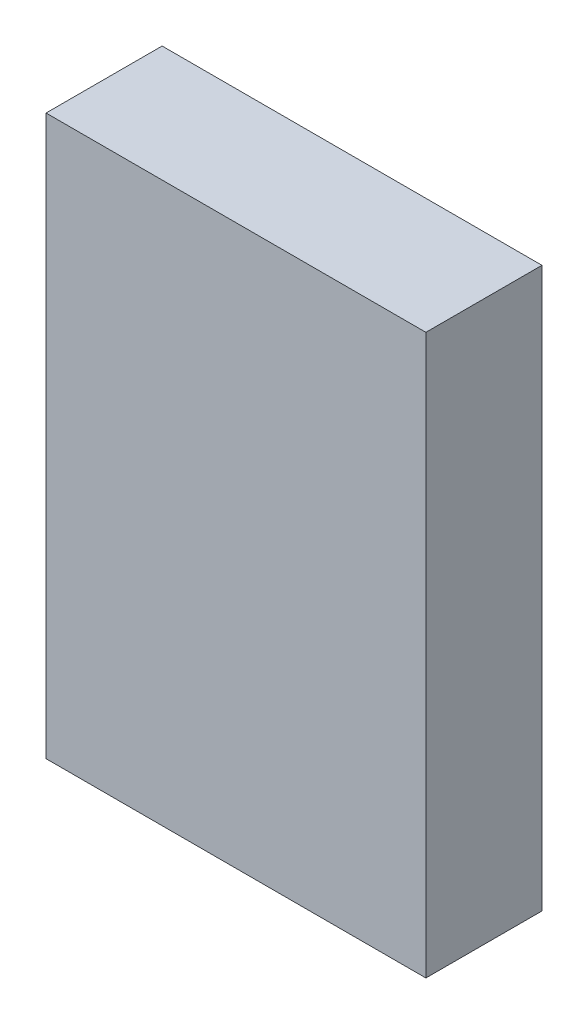
ISO-10303-21;
HEADER;
FILE_DESCRIPTION(('STEP AP214'),'2;1');
FILE_NAME('part.step','',(''),(''),'','','');
FILE_SCHEMA(('AUTOMOTIVE_DESIGN { 1 0 10303 214 1 1 1 1 }'));
ENDSEC;
DATA;
#1=APPLICATION_CONTEXT('core data for automotive mechanical design processes');
#2=APPLICATION_PROTOCOL_DEFINITION('international standard','automotive_design',2000,#1);
#3=PRODUCT_CONTEXT('',#1,'mechanical');
#4=PRODUCT('Part','Part','',(#3));
#5=PRODUCT_RELATED_PRODUCT_CATEGORY('part','',(#4));
#6=PRODUCT_DEFINITION_FORMATION('','',#4);
#7=PRODUCT_DEFINITION_CONTEXT('part definition',#1,'design');
#8=PRODUCT_DEFINITION('design','',#6,#7);
#9=PRODUCT_DEFINITION_SHAPE('','',#8);
#10=(LENGTH_UNIT() NAMED_UNIT(*) SI_UNIT(.MILLI.,.METRE.));
#11=(NAMED_UNIT(*) PLANE_ANGLE_UNIT() SI_UNIT($,.RADIAN.));
#12=(NAMED_UNIT(*) SI_UNIT($,.STERADIAN.) SOLID_ANGLE_UNIT());
#13=UNCERTAINTY_MEASURE_WITH_UNIT(LENGTH_MEASURE(1.E-05),#10,'distance_accuracy_value','');
#14=(GEOMETRIC_REPRESENTATION_CONTEXT(3) GLOBAL_UNCERTAINTY_ASSIGNED_CONTEXT((#13)) GLOBAL_UNIT_ASSIGNED_CONTEXT((#10,
#11,#12)) REPRESENTATION_CONTEXT('',''));
#15=CARTESIAN_POINT('',(0.,0.,0.));
#16=DIRECTION('',(0.,0.,1.));
#17=DIRECTION('',(1.,0.,0.));
#18=AXIS2_PLACEMENT_3D('',#15,#16,#17);
#19=CARTESIAN_POINT('',(-1.80002688,2.64997184,1.10000034));
#20=DIRECTION('',(0.,0.,-1.));
#21=DIRECTION('',(-1.,0.,0.));
#22=AXIS2_PLACEMENT_3D('',#19,#20,#21);
#23=PLANE('',#22);
#24=DIRECTION('',(1.,0.,0.));
#25=VECTOR('',#24,1.);
#26=CARTESIAN_POINT('',(-1.80002688,-2.64997184,1.10000034));
#27=LINE('',#26,#25);
#28=CARTESIAN_POINT('',(-1.80002688,-2.64997184,1.10000034));
#29=VERTEX_POINT('',#28);
#30=CARTESIAN_POINT('',(1.80002688,-2.64997184,1.10000034));
#31=VERTEX_POINT('',#30);
#32=EDGE_CURVE('E55',#29,#31,#27,.T.);
#33=ORIENTED_EDGE('',*,*,#32,.T.);
#34=DIRECTION('',(0.,1.,0.));
#35=VECTOR('',#34,1.);
#36=CARTESIAN_POINT('',(1.80002688,-2.64997184,1.10000034));
#37=LINE('',#36,#35);
#38=CARTESIAN_POINT('',(1.80002688,2.64997184,1.10000034));
#39=VERTEX_POINT('',#38);
#40=EDGE_CURVE('E57',#31,#39,#37,.T.);
#41=ORIENTED_EDGE('',*,*,#40,.T.);
#42=DIRECTION('',(1.,0.,0.));
#43=VECTOR('',#42,1.);
#44=CARTESIAN_POINT('',(1.80002688,2.64997184,1.10000034));
#45=LINE('',#44,#43);
#46=CARTESIAN_POINT('',(-1.80002688,2.64997184,1.10000034));
#47=VERTEX_POINT('',#46);
#48=EDGE_CURVE('E20',#39,#47,#45,.F.);
#49=ORIENTED_EDGE('',*,*,#48,.T.);
#50=DIRECTION('',(0.,1.,0.));
#51=VECTOR('',#50,1.);
#52=CARTESIAN_POINT('',(-1.80002688,2.64997184,1.10000034));
#53=LINE('',#52,#51);
#54=EDGE_CURVE('E80',#47,#29,#53,.F.);
#55=ORIENTED_EDGE('',*,*,#54,.T.);
#56=EDGE_LOOP('',(#33,#41,#49,#55));
#57=FACE_BOUND('',#56,.T.);
#58=ADVANCED_FACE('F17',(#57),#23,.F.);
#59=CARTESIAN_POINT('',(1.80002688,2.64997184,0.));
#60=DIRECTION('',(0.,-1.,0.));
#61=DIRECTION('',(0.,0.,-1.));
#62=AXIS2_PLACEMENT_3D('',#59,#60,#61);
#63=PLANE('',#62);
#64=DIRECTION('',(0.,0.,-1.));
#65=VECTOR('',#64,1.);
#66=CARTESIAN_POINT('',(-1.80002688,2.64997184,0.));
#67=LINE('',#66,#65);
#68=CARTESIAN_POINT('',(-1.80002688,2.64997184,0.));
#69=VERTEX_POINT('',#68);
#70=EDGE_CURVE('E68',#69,#47,#67,.F.);
#71=ORIENTED_EDGE('',*,*,#70,.T.);
#72=ORIENTED_EDGE('',*,*,#48,.F.);
#73=DIRECTION('',(0.,0.,1.));
#74=VECTOR('',#73,1.);
#75=CARTESIAN_POINT('',(1.80002688,2.64997184,0.));
#76=LINE('',#75,#74);
#77=CARTESIAN_POINT('',(1.80002688,2.64997184,0.));
#78=VERTEX_POINT('',#77);
#79=EDGE_CURVE('E63',#39,#78,#76,.F.);
#80=ORIENTED_EDGE('',*,*,#79,.T.);
#81=DIRECTION('',(-1.,0.,0.));
#82=VECTOR('',#81,1.);
#83=CARTESIAN_POINT('',(-1.80002688,2.64997184,0.));
#84=LINE('',#83,#82);
#85=EDGE_CURVE('E83',#69,#78,#84,.F.);
#86=ORIENTED_EDGE('',*,*,#85,.F.);
#87=EDGE_LOOP('',(#71,#72,#80,#86));
#88=FACE_BOUND('',#87,.T.);
#89=ADVANCED_FACE('F65',(#88),#63,.F.);
#90=CARTESIAN_POINT('',(1.80002688,-2.64997184,0.));
#91=DIRECTION('',(-1.,0.,0.));
#92=DIRECTION('',(0.,0.,1.));
#93=AXIS2_PLACEMENT_3D('',#90,#91,#92);
#94=PLANE('',#93);
#95=ORIENTED_EDGE('',*,*,#79,.F.);
#96=ORIENTED_EDGE('',*,*,#40,.F.);
#97=DIRECTION('',(0.,0.,1.));
#98=VECTOR('',#97,1.);
#99=CARTESIAN_POINT('',(1.80002688,-2.64997184,0.));
#100=LINE('',#99,#98);
#101=CARTESIAN_POINT('',(1.80002688,-2.64997184,0.));
#102=VERTEX_POINT('',#101);
#103=EDGE_CURVE('E75',#31,#102,#100,.F.);
#104=ORIENTED_EDGE('',*,*,#103,.T.);
#105=DIRECTION('',(0.,1.,0.));
#106=VECTOR('',#105,1.);
#107=CARTESIAN_POINT('',(1.80002688,2.64997184,0.));
#108=LINE('',#107,#106);
#109=EDGE_CURVE('E72',#78,#102,#108,.F.);
#110=ORIENTED_EDGE('',*,*,#109,.F.);
#111=EDGE_LOOP('',(#95,#96,#104,#110));
#112=FACE_BOUND('',#111,.T.);
#113=ADVANCED_FACE('F70',(#112),#94,.F.);
#114=CARTESIAN_POINT('',(-1.80002688,-2.64997184,0.));
#115=DIRECTION('',(0.,1.,0.));
#116=DIRECTION('',(0.,0.,1.));
#117=AXIS2_PLACEMENT_3D('',#114,#115,#116);
#118=PLANE('',#117);
#119=ORIENTED_EDGE('',*,*,#103,.F.);
#120=ORIENTED_EDGE('',*,*,#32,.F.);
#121=DIRECTION('',(0.,0.,-1.));
#122=VECTOR('',#121,1.);
#123=CARTESIAN_POINT('',(-1.80002688,-2.64997184,0.));
#124=LINE('',#123,#122);
#125=CARTESIAN_POINT('',(-1.80002688,-2.64997184,0.));
#126=VERTEX_POINT('',#125);
#127=EDGE_CURVE('E35',#29,#126,#124,.T.);
#128=ORIENTED_EDGE('',*,*,#127,.T.);
#129=DIRECTION('',(-1.,0.,0.));
#130=VECTOR('',#129,1.);
#131=CARTESIAN_POINT('',(-1.80002688,-2.64997184,0.));
#132=LINE('',#131,#130);
#133=EDGE_CURVE('E26',#102,#126,#132,.T.);
#134=ORIENTED_EDGE('',*,*,#133,.F.);
#135=EDGE_LOOP('',(#119,#120,#128,#134));
#136=FACE_BOUND('',#135,.T.);
#137=ADVANCED_FACE('F89',(#136),#118,.F.);
#138=CARTESIAN_POINT('',(-1.80002688,2.64997184,0.));
#139=DIRECTION('',(1.,0.,0.));
#140=DIRECTION('',(0.,0.,-1.));
#141=AXIS2_PLACEMENT_3D('',#138,#139,#140);
#142=PLANE('',#141);
#143=ORIENTED_EDGE('',*,*,#127,.F.);
#144=ORIENTED_EDGE('',*,*,#54,.F.);
#145=ORIENTED_EDGE('',*,*,#70,.F.);
#146=DIRECTION('',(0.,1.,0.));
#147=VECTOR('',#146,1.);
#148=CARTESIAN_POINT('',(-1.80002688,2.64997184,0.));
#149=LINE('',#148,#147);
#150=EDGE_CURVE('E11',#126,#69,#149,.T.);
#151=ORIENTED_EDGE('',*,*,#150,.F.);
#152=EDGE_LOOP('',(#143,#144,#145,#151));
#153=FACE_BOUND('',#152,.T.);
#154=ADVANCED_FACE('F91',(#153),#142,.F.);
#155=CARTESIAN_POINT('',(-1.80002688,2.64997184,0.));
#156=DIRECTION('',(0.,0.,-1.));
#157=DIRECTION('',(-1.,0.,0.));
#158=AXIS2_PLACEMENT_3D('',#155,#156,#157);
#159=PLANE('',#158);
#160=ORIENTED_EDGE('',*,*,#133,.T.);
#161=ORIENTED_EDGE('',*,*,#150,.T.);
#162=ORIENTED_EDGE('',*,*,#85,.T.);
#163=ORIENTED_EDGE('',*,*,#109,.T.);
#164=EDGE_LOOP('',(#160,#161,#162,#163));
#165=FACE_BOUND('',#164,.T.);
#166=ADVANCED_FACE('F88',(#165),#159,.T.);
#167=CLOSED_SHELL('',(#58,#89,#113,#137,#154,#166));
#168=MANIFOLD_SOLID_BREP('B1',#167);
#169=ADVANCED_BREP_SHAPE_REPRESENTATION('',(#18,#168),#14);
#170=SHAPE_DEFINITION_REPRESENTATION(#9,#169);
ENDSEC;
END-ISO-10303-21;
